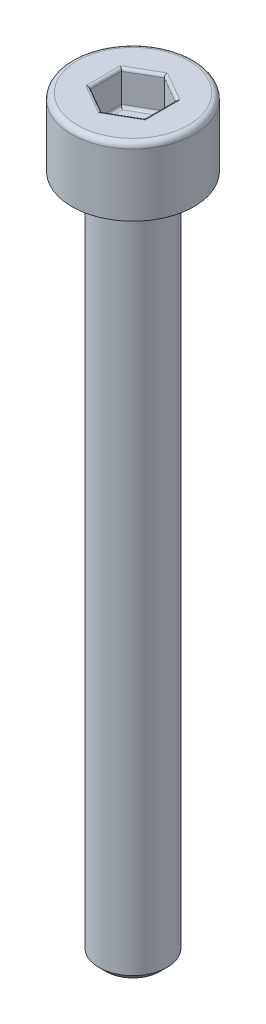
ISO-10303-21;
HEADER;
FILE_DESCRIPTION(('STEP AP214'),'2;1');
FILE_NAME('part.step','',(''),(''),'','','');
FILE_SCHEMA(('AUTOMOTIVE_DESIGN { 1 0 10303 214 1 1 1 1 }'));
ENDSEC;
DATA;
#1=APPLICATION_CONTEXT('core data for automotive mechanical design processes');
#2=APPLICATION_PROTOCOL_DEFINITION('international standard','automotive_design',2000,#1);
#3=PRODUCT_CONTEXT('',#1,'mechanical');
#4=PRODUCT('Part','Part','',(#3));
#5=PRODUCT_RELATED_PRODUCT_CATEGORY('part','',(#4));
#6=PRODUCT_DEFINITION_FORMATION('','',#4);
#7=PRODUCT_DEFINITION_CONTEXT('part definition',#1,'design');
#8=PRODUCT_DEFINITION('design','',#6,#7);
#9=PRODUCT_DEFINITION_SHAPE('','',#8);
#10=(LENGTH_UNIT() NAMED_UNIT(*) SI_UNIT(.MILLI.,.METRE.));
#11=(NAMED_UNIT(*) PLANE_ANGLE_UNIT() SI_UNIT($,.RADIAN.));
#12=(NAMED_UNIT(*) SI_UNIT($,.STERADIAN.) SOLID_ANGLE_UNIT());
#13=UNCERTAINTY_MEASURE_WITH_UNIT(LENGTH_MEASURE(1.E-05),#10,'distance_accuracy_value','');
#14=(GEOMETRIC_REPRESENTATION_CONTEXT(3) GLOBAL_UNCERTAINTY_ASSIGNED_CONTEXT((#13)) GLOBAL_UNIT_ASSIGNED_CONTEXT((#10,
#11,#12)) REPRESENTATION_CONTEXT('',''));
#15=CARTESIAN_POINT('',(0.,0.,0.));
#16=DIRECTION('',(0.,0.,1.));
#17=DIRECTION('',(1.,0.,0.));
#18=AXIS2_PLACEMENT_3D('',#15,#16,#17);
#19=CARTESIAN_POINT('',(0.,-27.5,0.));
#20=DIRECTION('',(0.,-1.,0.));
#21=DIRECTION('',(0.,0.,-1.));
#22=AXIS2_PLACEMENT_3D('',#19,#20,#21);
#23=PLANE('',#22);
#24=CARTESIAN_POINT('',(0.,-27.5,0.));
#25=DIRECTION('',(0.,-1.,0.));
#26=DIRECTION('',(0.,0.,-1.));
#27=AXIS2_PLACEMENT_3D('',#24,#25,#26);
#28=CIRCLE('',#27,0.999999999999997);
#29=CARTESIAN_POINT('',(0.,-27.5,-0.999999999999997));
#30=VERTEX_POINT('',#29);
#31=EDGE_CURVE('E261',#30,#30,#28,.T.);
#32=ORIENTED_EDGE('',*,*,#31,.T.);
#33=EDGE_LOOP('',(#32));
#34=FACE_BOUND('',#33,.T.);
#35=ADVANCED_FACE('F33',(#34),#23,.T.);
#36=CARTESIAN_POINT('',(0.,0.,0.));
#37=DIRECTION('',(0.,1.,0.));
#38=DIRECTION('',(0.,0.,1.));
#39=AXIS2_PLACEMENT_3D('',#36,#37,#38);
#40=CYLINDRICAL_SURFACE('',#39,1.25);
#41=CARTESIAN_POINT('',(0.,-2.75,0.));
#42=DIRECTION('',(0.,-1.,0.));
#43=DIRECTION('',(0.,0.,-1.));
#44=AXIS2_PLACEMENT_3D('',#41,#42,#43);
#45=CIRCLE('',#44,1.25);
#46=CARTESIAN_POINT('',(0.,-2.75,-1.25));
#47=VERTEX_POINT('',#46);
#48=EDGE_CURVE('E258',#47,#47,#45,.T.);
#49=ORIENTED_EDGE('',*,*,#48,.T.);
#50=EDGE_LOOP('',(#49));
#51=FACE_BOUND('',#50,.T.);
#52=CARTESIAN_POINT('',(0.,-27.25,0.));
#53=DIRECTION('',(0.,-1.,0.));
#54=DIRECTION('',(0.,0.,-1.));
#55=AXIS2_PLACEMENT_3D('',#52,#53,#54);
#56=CIRCLE('',#55,1.25);
#57=CARTESIAN_POINT('',(0.,-27.25,-1.25));
#58=VERTEX_POINT('',#57);
#59=EDGE_CURVE('E255',#58,#58,#56,.F.);
#60=ORIENTED_EDGE('',*,*,#59,.T.);
#61=EDGE_LOOP('',(#60));
#62=FACE_BOUND('',#61,.T.);
#63=ADVANCED_FACE('F287',(#51,#62),#40,.T.);
#64=CARTESIAN_POINT('',(-1.25,-2.5,0.));
#65=DIRECTION('',(0.,-1.,0.));
#66=DIRECTION('',(0.,0.,-1.));
#67=AXIS2_PLACEMENT_3D('',#64,#65,#66);
#68=PLANE('',#67);
#69=CARTESIAN_POINT('',(0.,-2.5,0.));
#70=DIRECTION('',(0.,-1.,0.));
#71=DIRECTION('',(0.,0.,-1.));
#72=AXIS2_PLACEMENT_3D('',#69,#70,#71);
#73=CIRCLE('',#72,1.49999999999999);
#74=CARTESIAN_POINT('',(0.,-2.5,-1.49999999999999));
#75=VERTEX_POINT('',#74);
#76=EDGE_CURVE('E252',#75,#75,#73,.F.);
#77=ORIENTED_EDGE('',*,*,#76,.T.);
#78=EDGE_LOOP('',(#77));
#79=FACE_BOUND('',#78,.T.);
#80=CARTESIAN_POINT('',(0.,-2.5,0.));
#81=DIRECTION('',(0.,1.,0.));
#82=DIRECTION('',(0.,0.,1.));
#83=AXIS2_PLACEMENT_3D('',#80,#81,#82);
#84=CIRCLE('',#83,2.25);
#85=CARTESIAN_POINT('',(0.,-2.5,2.25));
#86=VERTEX_POINT('',#85);
#87=EDGE_CURVE('E249',#86,#86,#84,.T.);
#88=ORIENTED_EDGE('',*,*,#87,.F.);
#89=EDGE_LOOP('',(#88));
#90=FACE_BOUND('',#89,.T.);
#91=ADVANCED_FACE('F293',(#79,#90),#68,.T.);
#92=CARTESIAN_POINT('',(0.,0.,0.));
#93=DIRECTION('',(0.,1.,0.));
#94=DIRECTION('',(0.,0.,1.));
#95=AXIS2_PLACEMENT_3D('',#92,#93,#94);
#96=CYLINDRICAL_SURFACE('',#95,2.25);
#97=CARTESIAN_POINT('',(0.,-0.2,0.));
#98=DIRECTION('',(0.,1.,0.));
#99=DIRECTION('',(0.,0.,1.));
#100=AXIS2_PLACEMENT_3D('',#97,#98,#99);
#101=CIRCLE('',#100,2.25);
#102=CARTESIAN_POINT('',(0.,-0.2,2.25));
#103=VERTEX_POINT('',#102);
#104=EDGE_CURVE('E159',#103,#103,#101,.F.);
#105=ORIENTED_EDGE('',*,*,#104,.T.);
#106=EDGE_LOOP('',(#105));
#107=FACE_BOUND('',#106,.T.);
#108=ORIENTED_EDGE('',*,*,#87,.T.);
#109=EDGE_LOOP('',(#108));
#110=FACE_BOUND('',#109,.T.);
#111=ADVANCED_FACE('F303',(#107,#110),#96,.T.);
#112=CARTESIAN_POINT('',(-2.25,0.,0.));
#113=DIRECTION('',(0.,1.,0.));
#114=DIRECTION('',(0.,0.,1.));
#115=AXIS2_PLACEMENT_3D('',#112,#113,#114);
#116=PLANE('',#115);
#117=DIRECTION('',(0.,0.,1.));
#118=VECTOR('',#117,1.);
#119=CARTESIAN_POINT('',(-1.1,0.,-0.577350269189627));
#120=LINE('',#119,#118);
#121=CARTESIAN_POINT('',(-1.1,0.,0.635085296108588));
#122=VERTEX_POINT('',#121);
#123=CARTESIAN_POINT('',(-1.1,0.,-0.635085296108589));
#124=VERTEX_POINT('',#123);
#125=EDGE_CURVE('E175',#122,#124,#120,.F.);
#126=ORIENTED_EDGE('',*,*,#125,.T.);
#127=DIRECTION('',(-0.866025403784439,0.,0.5));
#128=VECTOR('',#127,1.);
#129=CARTESIAN_POINT('',(-0.0500000000000009,0.,-1.2413030787577));
#130=LINE('',#129,#128);
#131=CARTESIAN_POINT('',(0.,0.,-1.27017059221718));
#132=VERTEX_POINT('',#131);
#133=EDGE_CURVE('E134',#124,#132,#130,.F.);
#134=ORIENTED_EDGE('',*,*,#133,.T.);
#135=DIRECTION('',(-0.866025403784439,0.,-0.5));
#136=VECTOR('',#135,1.);
#137=CARTESIAN_POINT('',(1.05,0.,-0.663952809568071));
#138=LINE('',#137,#136);
#139=CARTESIAN_POINT('',(1.1,0.,-0.63508529610859));
#140=VERTEX_POINT('',#139);
#141=EDGE_CURVE('E161',#132,#140,#138,.F.);
#142=ORIENTED_EDGE('',*,*,#141,.T.);
#143=DIRECTION('',(0.,0.,-1.));
#144=VECTOR('',#143,1.);
#145=CARTESIAN_POINT('',(1.1,0.,0.577350269189625));
#146=LINE('',#145,#144);
#147=CARTESIAN_POINT('',(1.1,0.,0.635085296108588));
#148=VERTEX_POINT('',#147);
#149=EDGE_CURVE('E169',#140,#148,#146,.F.);
#150=ORIENTED_EDGE('',*,*,#149,.T.);
#151=DIRECTION('',(0.866025403784439,0.,-0.5));
#152=VECTOR('',#151,1.);
#153=CARTESIAN_POINT('',(0.0499999999999991,0.,1.24130307875769));
#154=LINE('',#153,#152);
#155=CARTESIAN_POINT('',(0.,0.,1.27017059221718));
#156=VERTEX_POINT('',#155);
#157=EDGE_CURVE('E171',#148,#156,#154,.F.);
#158=ORIENTED_EDGE('',*,*,#157,.T.);
#159=DIRECTION('',(0.866025403784439,0.,0.5));
#160=VECTOR('',#159,1.);
#161=CARTESIAN_POINT('',(-1.05,0.,0.663952809568069));
#162=LINE('',#161,#160);
#163=EDGE_CURVE('E173',#156,#122,#162,.F.);
#164=ORIENTED_EDGE('',*,*,#163,.T.);
#165=EDGE_LOOP('',(#126,#134,#142,#150,#158,#164));
#166=FACE_BOUND('',#165,.T.);
#167=CARTESIAN_POINT('',(0.,0.,0.));
#168=DIRECTION('',(0.,1.,0.));
#169=DIRECTION('',(0.,0.,1.));
#170=AXIS2_PLACEMENT_3D('',#167,#168,#169);
#171=CIRCLE('',#170,2.05);
#172=CARTESIAN_POINT('',(0.,0.,2.05));
#173=VERTEX_POINT('',#172);
#174=EDGE_CURVE('E164',#173,#173,#171,.T.);
#175=ORIENTED_EDGE('',*,*,#174,.T.);
#176=EDGE_LOOP('',(#175));
#177=FACE_BOUND('',#176,.T.);
#178=ADVANCED_FACE('F266',(#166,#177),#116,.T.);
#179=CARTESIAN_POINT('',(0.,-2.5,0.));
#180=DIRECTION('',(0.,1.,0.));
#181=DIRECTION('',(0.,0.,1.));
#182=AXIS2_PLACEMENT_3D('',#179,#180,#181);
#183=CONICAL_SURFACE('',#182,1.49999999999999,0.78539816339745);
#184=ORIENTED_EDGE('',*,*,#48,.F.);
#185=EDGE_LOOP('',(#184));
#186=FACE_BOUND('',#185,.T.);
#187=ORIENTED_EDGE('',*,*,#76,.F.);
#188=EDGE_LOOP('',(#187));
#189=FACE_BOUND('',#188,.T.);
#190=ADVANCED_FACE('F281',(#186,#189),#183,.T.);
#191=CARTESIAN_POINT('',(0.,-27.25,0.));
#192=DIRECTION('',(0.,1.,0.));
#193=DIRECTION('',(0.,0.,1.));
#194=AXIS2_PLACEMENT_3D('',#191,#192,#193);
#195=CONICAL_SURFACE('',#194,1.25,0.785398163397446);
#196=ORIENTED_EDGE('',*,*,#31,.F.);
#197=EDGE_LOOP('',(#196));
#198=FACE_BOUND('',#197,.T.);
#199=ORIENTED_EDGE('',*,*,#59,.F.);
#200=EDGE_LOOP('',(#199));
#201=FACE_BOUND('',#200,.T.);
#202=ADVANCED_FACE('F271',(#198,#201),#195,.T.);
#203=CARTESIAN_POINT('',(0.,-0.2,0.));
#204=DIRECTION('',(0.,1.,0.));
#205=DIRECTION('',(0.,0.,1.));
#206=AXIS2_PLACEMENT_3D('',#203,#204,#205);
#207=TOROIDAL_SURFACE('',#206,2.05,0.2);
#208=ORIENTED_EDGE('',*,*,#104,.F.);
#209=EDGE_LOOP('',(#208));
#210=FACE_BOUND('',#209,.T.);
#211=ORIENTED_EDGE('',*,*,#174,.F.);
#212=EDGE_LOOP('',(#211));
#213=FACE_BOUND('',#212,.T.);
#214=ADVANCED_FACE('F268',(#210,#213),#207,.T.);
#215=CARTESIAN_POINT('',(0.999999999999998,-1.25,-0.577350269189627));
#216=DIRECTION('',(0.5,0.,-0.866025403784439));
#217=DIRECTION('',(-0.866025403784439,0.,-0.5));
#218=AXIS2_PLACEMENT_3D('',#215,#216,#217);
#219=PLANE('',#218);
#220=DIRECTION('',(0.,1.,0.));
#221=VECTOR('',#220,1.);
#222=CARTESIAN_POINT('',(0.999999999999998,-1.25,-0.577350269189627));
#223=LINE('',#222,#221);
#224=CARTESIAN_POINT('',(0.999999999999998,-1.15,-0.577350269189627));
#225=VERTEX_POINT('',#224);
#226=CARTESIAN_POINT('',(0.999999999999998,-0.1,-0.577350269189627));
#227=VERTEX_POINT('',#226);
#228=EDGE_CURVE('E243',#225,#227,#223,.T.);
#229=ORIENTED_EDGE('',*,*,#228,.T.);
#230=DIRECTION('',(-0.866025403784439,0.,-0.5));
#231=VECTOR('',#230,1.);
#232=CARTESIAN_POINT('',(0.,-0.1,-1.15470053837925));
#233=LINE('',#232,#231);
#234=CARTESIAN_POINT('',(0.,-0.1,-1.15470053837925));
#235=VERTEX_POINT('',#234);
#236=EDGE_CURVE('E195',#227,#235,#233,.T.);
#237=ORIENTED_EDGE('',*,*,#236,.T.);
#238=DIRECTION('',(0.,1.,0.));
#239=VECTOR('',#238,1.);
#240=CARTESIAN_POINT('',(0.,-1.25,-1.15470053837925));
#241=LINE('',#240,#239);
#242=CARTESIAN_POINT('',(0.,-1.15,-1.15470053837925));
#243=VERTEX_POINT('',#242);
#244=EDGE_CURVE('E145',#243,#235,#241,.T.);
#245=ORIENTED_EDGE('',*,*,#244,.F.);
#246=DIRECTION('',(-0.866025403784439,0.,-0.5));
#247=VECTOR('',#246,1.);
#248=CARTESIAN_POINT('',(0.999999999999998,-1.15,-0.577350269189627));
#249=LINE('',#248,#247);
#250=EDGE_CURVE('E193',#243,#225,#249,.F.);
#251=ORIENTED_EDGE('',*,*,#250,.T.);
#252=EDGE_LOOP('',(#229,#237,#245,#251));
#253=FACE_BOUND('',#252,.T.);
#254=ADVANCED_FACE('F270',(#253),#219,.F.);
#255=CARTESIAN_POINT('',(0.999999999999999,-1.25,0.577350269189625));
#256=DIRECTION('',(1.,0.,0.));
#257=DIRECTION('',(0.,0.,-1.));
#258=AXIS2_PLACEMENT_3D('',#255,#256,#257);
#259=PLANE('',#258);
#260=DIRECTION('',(0.,1.,0.));
#261=VECTOR('',#260,1.);
#262=CARTESIAN_POINT('',(0.999999999999999,-1.25,0.577350269189625));
#263=LINE('',#262,#261);
#264=CARTESIAN_POINT('',(0.999999999999999,-1.15,0.577350269189625));
#265=VERTEX_POINT('',#264);
#266=CARTESIAN_POINT('',(0.999999999999999,-0.1,0.577350269189625));
#267=VERTEX_POINT('',#266);
#268=EDGE_CURVE('E240',#265,#267,#263,.T.);
#269=ORIENTED_EDGE('',*,*,#268,.T.);
#270=DIRECTION('',(0.,0.,-1.));
#271=VECTOR('',#270,1.);
#272=CARTESIAN_POINT('',(0.999999999999998,-0.1,-0.577350269189627));
#273=LINE('',#272,#271);
#274=EDGE_CURVE('E191',#267,#227,#273,.T.);
#275=ORIENTED_EDGE('',*,*,#274,.T.);
#276=ORIENTED_EDGE('',*,*,#228,.F.);
#277=DIRECTION('',(0.,0.,-1.));
#278=VECTOR('',#277,1.);
#279=CARTESIAN_POINT('',(0.999999999999999,-1.15,0.577350269189625));
#280=LINE('',#279,#278);
#281=EDGE_CURVE('E188',#225,#265,#280,.F.);
#282=ORIENTED_EDGE('',*,*,#281,.T.);
#283=EDGE_LOOP('',(#269,#275,#276,#282));
#284=FACE_BOUND('',#283,.T.);
#285=ADVANCED_FACE('F278',(#284),#259,.F.);
#286=CARTESIAN_POINT('',(0.,-1.25,1.15470053837925));
#287=DIRECTION('',(0.5,0.,0.866025403784439));
#288=DIRECTION('',(0.866025403784439,0.,-0.5));
#289=AXIS2_PLACEMENT_3D('',#286,#287,#288);
#290=PLANE('',#289);
#291=DIRECTION('',(0.,1.,0.));
#292=VECTOR('',#291,1.);
#293=CARTESIAN_POINT('',(0.,-1.25,1.15470053837925));
#294=LINE('',#293,#292);
#295=CARTESIAN_POINT('',(0.,-1.15,1.15470053837925));
#296=VERTEX_POINT('',#295);
#297=CARTESIAN_POINT('',(0.,-0.1,1.15470053837925));
#298=VERTEX_POINT('',#297);
#299=EDGE_CURVE('E237',#296,#298,#294,.T.);
#300=ORIENTED_EDGE('',*,*,#299,.T.);
#301=DIRECTION('',(0.866025403784439,0.,-0.5));
#302=VECTOR('',#301,1.);
#303=CARTESIAN_POINT('',(0.999999999999999,-0.1,0.577350269189625));
#304=LINE('',#303,#302);
#305=EDGE_CURVE('E186',#298,#267,#304,.T.);
#306=ORIENTED_EDGE('',*,*,#305,.T.);
#307=ORIENTED_EDGE('',*,*,#268,.F.);
#308=DIRECTION('',(0.866025403784439,0.,-0.5));
#309=VECTOR('',#308,1.);
#310=CARTESIAN_POINT('',(0.,-1.15,1.15470053837925));
#311=LINE('',#310,#309);
#312=EDGE_CURVE('E184',#265,#296,#311,.F.);
#313=ORIENTED_EDGE('',*,*,#312,.T.);
#314=EDGE_LOOP('',(#300,#306,#307,#313));
#315=FACE_BOUND('',#314,.T.);
#316=ADVANCED_FACE('F327',(#315),#290,.F.);
#317=CARTESIAN_POINT('',(-1.,-1.25,0.577350269189625));
#318=DIRECTION('',(-0.5,0.,0.866025403784438));
#319=DIRECTION('',(0.866025403784439,0.,0.5));
#320=AXIS2_PLACEMENT_3D('',#317,#318,#319);
#321=PLANE('',#320);
#322=DIRECTION('',(0.,1.,0.));
#323=VECTOR('',#322,1.);
#324=CARTESIAN_POINT('',(-1.,-1.25,0.577350269189625));
#325=LINE('',#324,#323);
#326=CARTESIAN_POINT('',(-1.,-1.15,0.577350269189625));
#327=VERTEX_POINT('',#326);
#328=CARTESIAN_POINT('',(-1.,-0.1,0.577350269189625));
#329=VERTEX_POINT('',#328);
#330=EDGE_CURVE('E128',#327,#329,#325,.T.);
#331=ORIENTED_EDGE('',*,*,#330,.T.);
#332=DIRECTION('',(0.866025403784439,0.,0.5));
#333=VECTOR('',#332,1.);
#334=CARTESIAN_POINT('',(0.,-0.1,1.15470053837925));
#335=LINE('',#334,#333);
#336=EDGE_CURVE('E182',#329,#298,#335,.T.);
#337=ORIENTED_EDGE('',*,*,#336,.T.);
#338=ORIENTED_EDGE('',*,*,#299,.F.);
#339=DIRECTION('',(0.866025403784439,0.,0.5));
#340=VECTOR('',#339,1.);
#341=CARTESIAN_POINT('',(-1.,-1.15,0.577350269189625));
#342=LINE('',#341,#340);
#343=EDGE_CURVE('E180',#296,#327,#342,.F.);
#344=ORIENTED_EDGE('',*,*,#343,.T.);
#345=EDGE_LOOP('',(#331,#337,#338,#344));
#346=FACE_BOUND('',#345,.T.);
#347=ADVANCED_FACE('F234',(#346),#321,.F.);
#348=CARTESIAN_POINT('',(-1.,-1.25,-0.577350269189627));
#349=DIRECTION('',(-1.,0.,0.));
#350=DIRECTION('',(0.,0.,1.));
#351=AXIS2_PLACEMENT_3D('',#348,#349,#350);
#352=PLANE('',#351);
#353=DIRECTION('',(0.,1.,0.));
#354=VECTOR('',#353,1.);
#355=CARTESIAN_POINT('',(-1.,-1.25,-0.577350269189627));
#356=LINE('',#355,#354);
#357=CARTESIAN_POINT('',(-1.,-1.15,-0.577350269189627));
#358=VERTEX_POINT('',#357);
#359=CARTESIAN_POINT('',(-1.,-0.1,-0.577350269189627));
#360=VERTEX_POINT('',#359);
#361=EDGE_CURVE('E126',#358,#360,#356,.T.);
#362=ORIENTED_EDGE('',*,*,#361,.T.);
#363=DIRECTION('',(0.,0.,1.));
#364=VECTOR('',#363,1.);
#365=CARTESIAN_POINT('',(-1.,-0.1,0.577350269189625));
#366=LINE('',#365,#364);
#367=EDGE_CURVE('E133',#360,#329,#366,.T.);
#368=ORIENTED_EDGE('',*,*,#367,.T.);
#369=ORIENTED_EDGE('',*,*,#330,.F.);
#370=DIRECTION('',(0.,0.,1.));
#371=VECTOR('',#370,1.);
#372=CARTESIAN_POINT('',(-1.,-1.15,-0.577350269189627));
#373=LINE('',#372,#371);
#374=EDGE_CURVE('E123',#327,#358,#373,.F.);
#375=ORIENTED_EDGE('',*,*,#374,.T.);
#376=EDGE_LOOP('',(#362,#368,#369,#375));
#377=FACE_BOUND('',#376,.T.);
#378=ADVANCED_FACE('F125',(#377),#352,.F.);
#379=CARTESIAN_POINT('',(0.,-1.25,-1.15470053837925));
#380=DIRECTION('',(-0.5,0.,-0.866025403784438));
#381=DIRECTION('',(-0.866025403784439,0.,0.5));
#382=AXIS2_PLACEMENT_3D('',#379,#380,#381);
#383=PLANE('',#382);
#384=ORIENTED_EDGE('',*,*,#244,.T.);
#385=DIRECTION('',(-0.866025403784439,0.,0.5));
#386=VECTOR('',#385,1.);
#387=CARTESIAN_POINT('',(-1.,-0.1,-0.577350269189626));
#388=LINE('',#387,#386);
#389=EDGE_CURVE('E144',#235,#360,#388,.T.);
#390=ORIENTED_EDGE('',*,*,#389,.T.);
#391=ORIENTED_EDGE('',*,*,#361,.F.);
#392=DIRECTION('',(-0.866025403784439,0.,0.5));
#393=VECTOR('',#392,1.);
#394=CARTESIAN_POINT('',(0.,-1.15,-1.15470053837925));
#395=LINE('',#394,#393);
#396=EDGE_CURVE('E141',#358,#243,#395,.F.);
#397=ORIENTED_EDGE('',*,*,#396,.T.);
#398=EDGE_LOOP('',(#384,#390,#391,#397));
#399=FACE_BOUND('',#398,.T.);
#400=ADVANCED_FACE('F139',(#399),#383,.F.);
#401=CARTESIAN_POINT('',(0.,-1.25,-1.15470053837925));
#402=DIRECTION('',(0.,1.,0.));
#403=DIRECTION('',(0.,0.,1.));
#404=AXIS2_PLACEMENT_3D('',#401,#402,#403);
#405=PLANE('',#404);
#406=DIRECTION('',(0.866025403784439,0.,-0.5));
#407=VECTOR('',#406,1.);
#408=CARTESIAN_POINT('',(0.949999999999999,-1.25,0.490747728811181));
#409=LINE('',#408,#407);
#410=CARTESIAN_POINT('',(0.,-1.25,1.03923048454133));
#411=VERTEX_POINT('',#410);
#412=CARTESIAN_POINT('',(0.899999999999999,-1.25,0.519615242270663));
#413=VERTEX_POINT('',#412);
#414=EDGE_CURVE('E42',#411,#413,#409,.T.);
#415=ORIENTED_EDGE('',*,*,#414,.T.);
#416=DIRECTION('',(0.,0.,-1.));
#417=VECTOR('',#416,1.);
#418=CARTESIAN_POINT('',(0.899999999999998,-1.25,-1.15470053837925));
#419=LINE('',#418,#417);
#420=CARTESIAN_POINT('',(0.899999999999998,-1.25,-0.519615242270664));
#421=VERTEX_POINT('',#420);
#422=EDGE_CURVE('E11',#413,#421,#419,.T.);
#423=ORIENTED_EDGE('',*,*,#422,.T.);
#424=DIRECTION('',(-0.866025403784439,0.,-0.5));
#425=VECTOR('',#424,1.);
#426=CARTESIAN_POINT('',(-0.0500000000000008,-1.25,-1.06809799800081));
#427=LINE('',#426,#425);
#428=CARTESIAN_POINT('',(0.,-1.25,-1.03923048454133));
#429=VERTEX_POINT('',#428);
#430=EDGE_CURVE('E197',#421,#429,#427,.T.);
#431=ORIENTED_EDGE('',*,*,#430,.T.);
#432=DIRECTION('',(-0.866025403784439,0.,0.5));
#433=VECTOR('',#432,1.);
#434=CARTESIAN_POINT('',(0.0499999999999993,-1.25,-1.06809799800081));
#435=LINE('',#434,#433);
#436=CARTESIAN_POINT('',(-0.9,-1.25,-0.519615242270664));
#437=VERTEX_POINT('',#436);
#438=EDGE_CURVE('E199',#429,#437,#435,.T.);
#439=ORIENTED_EDGE('',*,*,#438,.T.);
#440=DIRECTION('',(0.,0.,1.));
#441=VECTOR('',#440,1.);
#442=CARTESIAN_POINT('',(-0.9,-1.25,-1.15470053837925));
#443=LINE('',#442,#441);
#444=CARTESIAN_POINT('',(-0.9,-1.25,0.519615242270662));
#445=VERTEX_POINT('',#444);
#446=EDGE_CURVE('E150',#437,#445,#443,.T.);
#447=ORIENTED_EDGE('',*,*,#446,.T.);
#448=DIRECTION('',(0.866025403784439,0.,0.5));
#449=VECTOR('',#448,1.);
#450=CARTESIAN_POINT('',(-0.950000000000001,-1.25,0.490747728811181));
#451=LINE('',#450,#449);
#452=EDGE_CURVE('E53',#445,#411,#451,.T.);
#453=ORIENTED_EDGE('',*,*,#452,.T.);
#454=EDGE_LOOP('',(#415,#423,#431,#439,#447,#453));
#455=FACE_BOUND('',#454,.T.);
#456=ADVANCED_FACE('F322',(#455),#405,.T.);
#457=CARTESIAN_POINT('',(0.0499999999999991,-0.1,1.24130307875769));
#458=DIRECTION('',(-0.866025403784439,0.,0.5));
#459=DIRECTION('',(0.5,0.,0.866025403784439));
#460=AXIS2_PLACEMENT_3D('',#457,#458,#459);
#461=CYLINDRICAL_SURFACE('',#460,0.1);
#462=CARTESIAN_POINT('',(0.,-0.1,1.27017059221718));
#463=DIRECTION('',(-1.,0.,0.));
#464=DIRECTION('',(0.,0.,-1.));
#465=AXIS2_PLACEMENT_3D('',#462,#463,#464);
#466=ELLIPSE('',#465,0.115470053837925,0.1);
#467=EDGE_CURVE('E214',#156,#298,#466,.T.);
#468=ORIENTED_EDGE('',*,*,#467,.F.);
#469=ORIENTED_EDGE('',*,*,#157,.F.);
#470=CARTESIAN_POINT('',(1.1,-0.1,0.635085296108588));
#471=DIRECTION('',(-0.5,0.,0.866025403784439));
#472=DIRECTION('',(-0.866025403784439,0.,-0.5));
#473=AXIS2_PLACEMENT_3D('',#470,#471,#472);
#474=ELLIPSE('',#473,0.115470053837925,0.1);
#475=EDGE_CURVE('E217',#267,#148,#474,.F.);
#476=ORIENTED_EDGE('',*,*,#475,.F.);
#477=ORIENTED_EDGE('',*,*,#305,.F.);
#478=EDGE_LOOP('',(#468,#469,#476,#477));
#479=FACE_BOUND('',#478,.T.);
#480=ADVANCED_FACE('F334',(#479),#461,.T.);
#481=CARTESIAN_POINT('',(1.1,-0.1,0.577350269189625));
#482=DIRECTION('',(0.,0.,1.));
#483=DIRECTION('',(1.,0.,0.));
#484=AXIS2_PLACEMENT_3D('',#481,#482,#483);
#485=CYLINDRICAL_SURFACE('',#484,0.1);
#486=ORIENTED_EDGE('',*,*,#475,.T.);
#487=ORIENTED_EDGE('',*,*,#149,.F.);
#488=CARTESIAN_POINT('',(1.1,-0.1,-0.63508529610859));
#489=DIRECTION('',(0.5,0.,0.866025403784439));
#490=DIRECTION('',(-0.866025403784439,0.,0.5));
#491=AXIS2_PLACEMENT_3D('',#488,#489,#490);
#492=ELLIPSE('',#491,0.115470053837925,0.1);
#493=EDGE_CURVE('E211',#227,#140,#492,.F.);
#494=ORIENTED_EDGE('',*,*,#493,.F.);
#495=ORIENTED_EDGE('',*,*,#274,.F.);
#496=EDGE_LOOP('',(#486,#487,#494,#495));
#497=FACE_BOUND('',#496,.T.);
#498=ADVANCED_FACE('F338',(#497),#485,.T.);
#499=CARTESIAN_POINT('',(-1.05,-0.1,0.663952809568069));
#500=DIRECTION('',(-0.866025403784439,0.,-0.5));
#501=DIRECTION('',(-0.5,0.,0.866025403784438));
#502=AXIS2_PLACEMENT_3D('',#499,#500,#501);
#503=CYLINDRICAL_SURFACE('',#502,0.1);
#504=ORIENTED_EDGE('',*,*,#467,.T.);
#505=ORIENTED_EDGE('',*,*,#336,.F.);
#506=CARTESIAN_POINT('',(-1.1,-0.1,0.635085296108587));
#507=DIRECTION('',(-0.5,0.,-0.866025403784439));
#508=DIRECTION('',(0.866025403784439,0.,-0.5));
#509=AXIS2_PLACEMENT_3D('',#506,#507,#508);
#510=ELLIPSE('',#509,0.115470053837925,0.1);
#511=EDGE_CURVE('E208',#122,#329,#510,.T.);
#512=ORIENTED_EDGE('',*,*,#511,.F.);
#513=ORIENTED_EDGE('',*,*,#163,.F.);
#514=EDGE_LOOP('',(#504,#505,#512,#513));
#515=FACE_BOUND('',#514,.T.);
#516=ADVANCED_FACE('F344',(#515),#503,.T.);
#517=CARTESIAN_POINT('',(1.05,-0.1,-0.663952809568071));
#518=DIRECTION('',(0.866025403784439,0.,0.5));
#519=DIRECTION('',(0.5,0.,-0.866025403784439));
#520=AXIS2_PLACEMENT_3D('',#517,#518,#519);
#521=CYLINDRICAL_SURFACE('',#520,0.1);
#522=ORIENTED_EDGE('',*,*,#493,.T.);
#523=ORIENTED_EDGE('',*,*,#141,.F.);
#524=CARTESIAN_POINT('',(0.,-0.1,-1.27017059221718));
#525=DIRECTION('',(1.,0.,0.));
#526=DIRECTION('',(0.,0.,-1.));
#527=AXIS2_PLACEMENT_3D('',#524,#525,#526);
#528=ELLIPSE('',#527,0.115470053837925,0.1);
#529=EDGE_CURVE('E206',#235,#132,#528,.F.);
#530=ORIENTED_EDGE('',*,*,#529,.F.);
#531=ORIENTED_EDGE('',*,*,#236,.F.);
#532=EDGE_LOOP('',(#522,#523,#530,#531));
#533=FACE_BOUND('',#532,.T.);
#534=ADVANCED_FACE('F374',(#533),#521,.T.);
#535=CARTESIAN_POINT('',(-1.1,-0.1,-0.577350269189627));
#536=DIRECTION('',(0.,0.,-1.));
#537=DIRECTION('',(-1.,0.,0.));
#538=AXIS2_PLACEMENT_3D('',#535,#536,#537);
#539=CYLINDRICAL_SURFACE('',#538,0.1);
#540=ORIENTED_EDGE('',*,*,#511,.T.);
#541=ORIENTED_EDGE('',*,*,#367,.F.);
#542=CARTESIAN_POINT('',(-1.1,-0.1,-0.635085296108589));
#543=DIRECTION('',(0.5,0.,-0.866025403784439));
#544=DIRECTION('',(0.866025403784439,0.,0.5));
#545=AXIS2_PLACEMENT_3D('',#542,#543,#544);
#546=ELLIPSE('',#545,0.115470053837925,0.1);
#547=EDGE_CURVE('E204',#124,#360,#546,.T.);
#548=ORIENTED_EDGE('',*,*,#547,.F.);
#549=ORIENTED_EDGE('',*,*,#125,.F.);
#550=EDGE_LOOP('',(#540,#541,#548,#549));
#551=FACE_BOUND('',#550,.T.);
#552=ADVANCED_FACE('F369',(#551),#539,.T.);
#553=CARTESIAN_POINT('',(-0.0500000000000009,-0.1,-1.2413030787577));
#554=DIRECTION('',(0.866025403784439,0.,-0.5));
#555=DIRECTION('',(-0.5,0.,-0.866025403784438));
#556=AXIS2_PLACEMENT_3D('',#553,#554,#555);
#557=CYLINDRICAL_SURFACE('',#556,0.1);
#558=ORIENTED_EDGE('',*,*,#529,.T.);
#559=ORIENTED_EDGE('',*,*,#133,.F.);
#560=ORIENTED_EDGE('',*,*,#547,.T.);
#561=ORIENTED_EDGE('',*,*,#389,.F.);
#562=EDGE_LOOP('',(#558,#559,#560,#561));
#563=FACE_BOUND('',#562,.T.);
#564=ADVANCED_FACE('F365',(#563),#557,.T.);
#565=CARTESIAN_POINT('',(-0.9,-1.15,-1.15470053837925));
#566=DIRECTION('',(0.,0.,1.));
#567=DIRECTION('',(1.,0.,0.));
#568=AXIS2_PLACEMENT_3D('',#565,#566,#567);
#569=CYLINDRICAL_SURFACE('',#568,0.1);
#570=CARTESIAN_POINT('',(-0.900000000000001,-1.15,-0.519615242270664));
#571=DIRECTION('',(-0.5,0.,0.866025403784439));
#572=DIRECTION('',(0.866025403784439,0.,0.5));
#573=AXIS2_PLACEMENT_3D('',#570,#571,#572);
#574=ELLIPSE('',#573,0.115470053837925,0.1);
#575=EDGE_CURVE('E149',#358,#437,#574,.T.);
#576=ORIENTED_EDGE('',*,*,#575,.F.);
#577=ORIENTED_EDGE('',*,*,#374,.F.);
#578=CARTESIAN_POINT('',(-0.9,-1.15,0.519615242270662));
#579=DIRECTION('',(0.5,0.,0.866025403784439));
#580=DIRECTION('',(0.866025403784439,0.,-0.5));
#581=AXIS2_PLACEMENT_3D('',#578,#579,#580);
#582=ELLIPSE('',#581,0.115470053837925,0.1);
#583=EDGE_CURVE('E37',#445,#327,#582,.F.);
#584=ORIENTED_EDGE('',*,*,#583,.F.);
#585=ORIENTED_EDGE('',*,*,#446,.F.);
#586=EDGE_LOOP('',(#576,#577,#584,#585));
#587=FACE_BOUND('',#586,.T.);
#588=ADVANCED_FACE('F35',(#587),#569,.F.);
#589=CARTESIAN_POINT('',(-0.950000000000001,-1.15,0.490747728811181));
#590=DIRECTION('',(0.866025403784439,0.,0.5));
#591=DIRECTION('',(0.5,0.,-0.866025403784438));
#592=AXIS2_PLACEMENT_3D('',#589,#590,#591);
#593=CYLINDRICAL_SURFACE('',#592,0.1);
#594=ORIENTED_EDGE('',*,*,#583,.T.);
#595=ORIENTED_EDGE('',*,*,#343,.F.);
#596=CARTESIAN_POINT('',(0.,-1.15,1.03923048454133));
#597=DIRECTION('',(1.,0.,0.));
#598=DIRECTION('',(0.,0.,-1.));
#599=AXIS2_PLACEMENT_3D('',#596,#597,#598);
#600=ELLIPSE('',#599,0.115470053837925,0.1);
#601=EDGE_CURVE('E153',#411,#296,#600,.F.);
#602=ORIENTED_EDGE('',*,*,#601,.F.);
#603=ORIENTED_EDGE('',*,*,#452,.F.);
#604=EDGE_LOOP('',(#594,#595,#602,#603));
#605=FACE_BOUND('',#604,.T.);
#606=ADVANCED_FACE('F231',(#605),#593,.F.);
#607=CARTESIAN_POINT('',(0.0499999999999993,-1.15,-1.06809799800081));
#608=DIRECTION('',(-0.866025403784439,0.,0.5));
#609=DIRECTION('',(0.5,0.,0.866025403784438));
#610=AXIS2_PLACEMENT_3D('',#607,#608,#609);
#611=CYLINDRICAL_SURFACE('',#610,0.1);
#612=ORIENTED_EDGE('',*,*,#575,.T.);
#613=ORIENTED_EDGE('',*,*,#438,.F.);
#614=CARTESIAN_POINT('',(0.,-1.15,-1.03923048454133));
#615=DIRECTION('',(-1.,0.,0.));
#616=DIRECTION('',(0.,0.,1.));
#617=AXIS2_PLACEMENT_3D('',#614,#615,#616);
#618=ELLIPSE('',#617,0.115470053837925,0.1);
#619=EDGE_CURVE('E157',#243,#429,#618,.T.);
#620=ORIENTED_EDGE('',*,*,#619,.F.);
#621=ORIENTED_EDGE('',*,*,#396,.F.);
#622=EDGE_LOOP('',(#612,#613,#620,#621));
#623=FACE_BOUND('',#622,.T.);
#624=ADVANCED_FACE('F155',(#623),#611,.F.);
#625=CARTESIAN_POINT('',(0.949999999999999,-1.15,0.490747728811181));
#626=DIRECTION('',(0.866025403784439,0.,-0.5));
#627=DIRECTION('',(-0.5,0.,-0.866025403784439));
#628=AXIS2_PLACEMENT_3D('',#625,#626,#627);
#629=CYLINDRICAL_SURFACE('',#628,0.1);
#630=ORIENTED_EDGE('',*,*,#601,.T.);
#631=ORIENTED_EDGE('',*,*,#312,.F.);
#632=CARTESIAN_POINT('',(0.899999999999999,-1.15,0.519615242270662));
#633=DIRECTION('',(0.5,0.,-0.866025403784439));
#634=DIRECTION('',(-0.866025403784439,0.,-0.5));
#635=AXIS2_PLACEMENT_3D('',#632,#633,#634);
#636=ELLIPSE('',#635,0.115470053837925,0.1);
#637=EDGE_CURVE('E222',#413,#265,#636,.F.);
#638=ORIENTED_EDGE('',*,*,#637,.F.);
#639=ORIENTED_EDGE('',*,*,#414,.F.);
#640=EDGE_LOOP('',(#630,#631,#638,#639));
#641=FACE_BOUND('',#640,.T.);
#642=ADVANCED_FACE('F228',(#641),#629,.F.);
#643=CARTESIAN_POINT('',(-0.0500000000000008,-1.15,-1.06809799800081));
#644=DIRECTION('',(-0.866025403784439,0.,-0.5));
#645=DIRECTION('',(-0.5,0.,0.866025403784439));
#646=AXIS2_PLACEMENT_3D('',#643,#644,#645);
#647=CYLINDRICAL_SURFACE('',#646,0.1);
#648=ORIENTED_EDGE('',*,*,#619,.T.);
#649=ORIENTED_EDGE('',*,*,#430,.F.);
#650=CARTESIAN_POINT('',(0.899999999999998,-1.15,-0.519615242270664));
#651=DIRECTION('',(-0.5,0.,-0.866025403784439));
#652=DIRECTION('',(0.866025403784439,0.,-0.5));
#653=AXIS2_PLACEMENT_3D('',#650,#651,#652);
#654=ELLIPSE('',#653,0.115470053837925,0.1);
#655=EDGE_CURVE('E220',#225,#421,#654,.T.);
#656=ORIENTED_EDGE('',*,*,#655,.F.);
#657=ORIENTED_EDGE('',*,*,#250,.F.);
#658=EDGE_LOOP('',(#648,#649,#656,#657));
#659=FACE_BOUND('',#658,.T.);
#660=ADVANCED_FACE('F353',(#659),#647,.F.);
#661=CARTESIAN_POINT('',(0.899999999999998,-1.15,-1.15470053837925));
#662=DIRECTION('',(0.,0.,-1.));
#663=DIRECTION('',(-1.,0.,0.));
#664=AXIS2_PLACEMENT_3D('',#661,#662,#663);
#665=CYLINDRICAL_SURFACE('',#664,0.1);
#666=ORIENTED_EDGE('',*,*,#637,.T.);
#667=ORIENTED_EDGE('',*,*,#281,.F.);
#668=ORIENTED_EDGE('',*,*,#655,.T.);
#669=ORIENTED_EDGE('',*,*,#422,.F.);
#670=EDGE_LOOP('',(#666,#667,#668,#669));
#671=FACE_BOUND('',#670,.T.);
#672=ADVANCED_FACE('F350',(#671),#665,.F.);
#673=CLOSED_SHELL('',(#35,#63,#91,#111,#178,#190,#202,#214,#254,#285,#316,#347,#378,#400,#456,
#480,#498,#516,#534,#552,#564,#588,#606,#624,#642,#660,#672));
#674=MANIFOLD_SOLID_BREP('B2',#673);
#675=ADVANCED_BREP_SHAPE_REPRESENTATION('',(#18,#674),#14);
#676=SHAPE_DEFINITION_REPRESENTATION(#9,#675);
ENDSEC;
END-ISO-10303-21;
